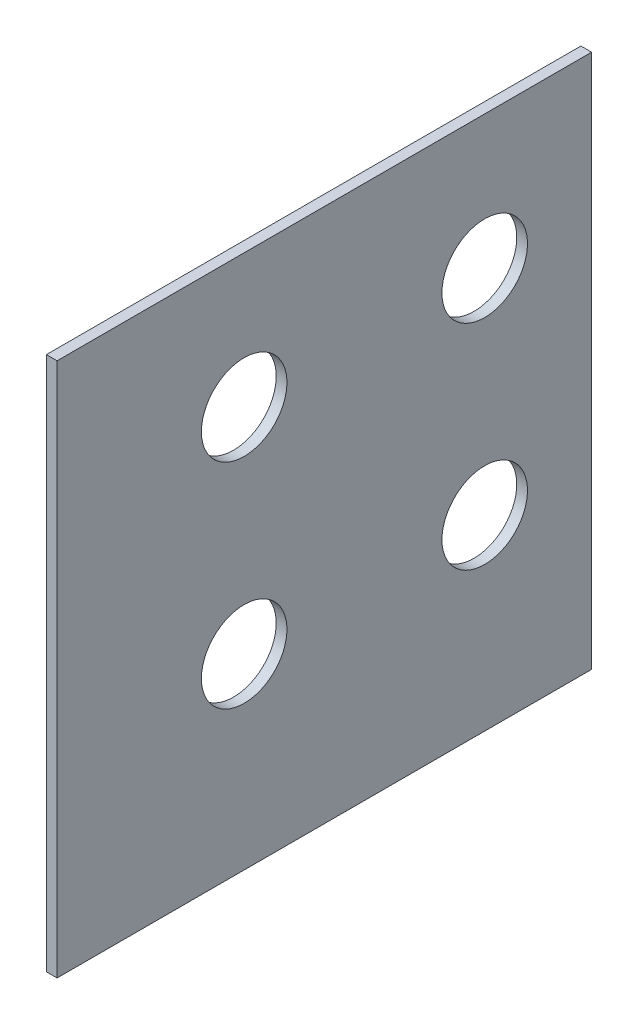
ISO-10303-21;
HEADER;
FILE_DESCRIPTION(('STEP AP214'),'2;1');
FILE_NAME('part.step','',(''),(''),'','','');
FILE_SCHEMA(('AUTOMOTIVE_DESIGN { 1 0 10303 214 1 1 1 1 }'));
ENDSEC;
DATA;
#1=APPLICATION_CONTEXT('core data for automotive mechanical design processes');
#2=APPLICATION_PROTOCOL_DEFINITION('international standard','automotive_design',2000,#1);
#3=PRODUCT_CONTEXT('',#1,'mechanical');
#4=PRODUCT('Part','Part','',(#3));
#5=PRODUCT_RELATED_PRODUCT_CATEGORY('part','',(#4));
#6=PRODUCT_DEFINITION_FORMATION('','',#4);
#7=PRODUCT_DEFINITION_CONTEXT('part definition',#1,'design');
#8=PRODUCT_DEFINITION('design','',#6,#7);
#9=PRODUCT_DEFINITION_SHAPE('','',#8);
#10=(LENGTH_UNIT() NAMED_UNIT(*) SI_UNIT(.MILLI.,.METRE.));
#11=(NAMED_UNIT(*) PLANE_ANGLE_UNIT() SI_UNIT($,.RADIAN.));
#12=(NAMED_UNIT(*) SI_UNIT($,.STERADIAN.) SOLID_ANGLE_UNIT());
#13=UNCERTAINTY_MEASURE_WITH_UNIT(LENGTH_MEASURE(1.E-05),#10,'distance_accuracy_value','');
#14=(GEOMETRIC_REPRESENTATION_CONTEXT(3) GLOBAL_UNCERTAINTY_ASSIGNED_CONTEXT((#13)) GLOBAL_UNIT_ASSIGNED_CONTEXT((#10,
#11,#12)) REPRESENTATION_CONTEXT('',''));
#15=CARTESIAN_POINT('',(0.,0.,0.));
#16=DIRECTION('',(0.,0.,1.));
#17=DIRECTION('',(1.,0.,0.));
#18=AXIS2_PLACEMENT_3D('',#15,#16,#17);
#19=CARTESIAN_POINT('',(0.4,-23.3926028357496,122.306860457024));
#20=DIRECTION('',(0.,0.,1.));
#21=DIRECTION('',(1.,0.,0.));
#22=AXIS2_PLACEMENT_3D('',#19,#20,#21);
#23=PLANE('',#22);
#24=DIRECTION('',(0.,1.,0.));
#25=VECTOR('',#24,1.);
#26=CARTESIAN_POINT('',(0.,-23.3926028357496,122.306860457024));
#27=LINE('',#26,#25);
#28=CARTESIAN_POINT('',(0.,-23.3926028357496,122.306860457024));
#29=VERTEX_POINT('',#28);
#30=CARTESIAN_POINT('',(0.,-3.39260283574958,122.306860457024));
#31=VERTEX_POINT('',#30);
#32=EDGE_CURVE('E98',#29,#31,#27,.T.);
#33=ORIENTED_EDGE('',*,*,#32,.T.);
#34=DIRECTION('',(-1.,0.,0.));
#35=VECTOR('',#34,1.);
#36=CARTESIAN_POINT('',(0.4,-3.39260283574958,122.306860457024));
#37=LINE('',#36,#35);
#38=CARTESIAN_POINT('',(0.4,-3.39260283574958,122.306860457024));
#39=VERTEX_POINT('',#38);
#40=EDGE_CURVE('E11',#39,#31,#37,.T.);
#41=ORIENTED_EDGE('',*,*,#40,.F.);
#42=DIRECTION('',(0.,1.,0.));
#43=VECTOR('',#42,1.);
#44=CARTESIAN_POINT('',(0.4,-23.3926028357496,122.306860457024));
#45=LINE('',#44,#43);
#46=CARTESIAN_POINT('',(0.4,-23.3926028357496,122.306860457024));
#47=VERTEX_POINT('',#46);
#48=EDGE_CURVE('E86',#47,#39,#45,.T.);
#49=ORIENTED_EDGE('',*,*,#48,.F.);
#50=DIRECTION('',(-1.,0.,0.));
#51=VECTOR('',#50,1.);
#52=CARTESIAN_POINT('',(0.4,-23.3926028357496,122.306860457024));
#53=LINE('',#52,#51);
#54=EDGE_CURVE('E94',#47,#29,#53,.T.);
#55=ORIENTED_EDGE('',*,*,#54,.T.);
#56=EDGE_LOOP('',(#33,#41,#49,#55));
#57=FACE_BOUND('',#56,.T.);
#58=ADVANCED_FACE('F35',(#57),#23,.F.);
#59=CARTESIAN_POINT('',(0.4,-3.39260283574958,122.306860457024));
#60=DIRECTION('',(0.,-1.,0.));
#61=DIRECTION('',(0.,0.,-1.));
#62=AXIS2_PLACEMENT_3D('',#59,#60,#61);
#63=PLANE('',#62);
#64=DIRECTION('',(0.,0.,1.));
#65=VECTOR('',#64,1.);
#66=CARTESIAN_POINT('',(0.,-3.39260283574958,122.306860457024));
#67=LINE('',#66,#65);
#68=CARTESIAN_POINT('',(0.,-3.39260283574959,142.306860457024));
#69=VERTEX_POINT('',#68);
#70=EDGE_CURVE('E90',#31,#69,#67,.T.);
#71=ORIENTED_EDGE('',*,*,#70,.T.);
#72=DIRECTION('',(-1.,0.,0.));
#73=VECTOR('',#72,1.);
#74=CARTESIAN_POINT('',(0.4,-3.39260283574959,142.306860457024));
#75=LINE('',#74,#73);
#76=CARTESIAN_POINT('',(0.4,-3.39260283574959,142.306860457024));
#77=VERTEX_POINT('',#76);
#78=EDGE_CURVE('E43',#77,#69,#75,.T.);
#79=ORIENTED_EDGE('',*,*,#78,.F.);
#80=DIRECTION('',(0.,0.,1.));
#81=VECTOR('',#80,1.);
#82=CARTESIAN_POINT('',(0.4,-3.39260283574958,122.306860457024));
#83=LINE('',#82,#81);
#84=EDGE_CURVE('E81',#39,#77,#83,.T.);
#85=ORIENTED_EDGE('',*,*,#84,.F.);
#86=ORIENTED_EDGE('',*,*,#40,.T.);
#87=EDGE_LOOP('',(#71,#79,#85,#86));
#88=FACE_BOUND('',#87,.T.);
#89=ADVANCED_FACE('F89',(#88),#63,.F.);
#90=CARTESIAN_POINT('',(0.4,-23.3926028357496,142.306860457024));
#91=DIRECTION('',(0.,0.,-1.));
#92=DIRECTION('',(-1.,0.,0.));
#93=AXIS2_PLACEMENT_3D('',#90,#91,#92);
#94=PLANE('',#93);
#95=DIRECTION('',(0.,-1.,0.));
#96=VECTOR('',#95,1.);
#97=CARTESIAN_POINT('',(0.,-23.3926028357496,142.306860457024));
#98=LINE('',#97,#96);
#99=CARTESIAN_POINT('',(0.,-23.3926028357496,142.306860457024));
#100=VERTEX_POINT('',#99);
#101=EDGE_CURVE('E68',#69,#100,#98,.T.);
#102=ORIENTED_EDGE('',*,*,#101,.T.);
#103=DIRECTION('',(-1.,0.,0.));
#104=VECTOR('',#103,1.);
#105=CARTESIAN_POINT('',(0.4,-23.3926028357496,142.306860457024));
#106=LINE('',#105,#104);
#107=CARTESIAN_POINT('',(0.4,-23.3926028357496,142.306860457024));
#108=VERTEX_POINT('',#107);
#109=EDGE_CURVE('E91',#108,#100,#106,.T.);
#110=ORIENTED_EDGE('',*,*,#109,.F.);
#111=DIRECTION('',(0.,-1.,0.));
#112=VECTOR('',#111,1.);
#113=CARTESIAN_POINT('',(0.4,-23.3926028357496,142.306860457024));
#114=LINE('',#113,#112);
#115=EDGE_CURVE('E84',#77,#108,#114,.T.);
#116=ORIENTED_EDGE('',*,*,#115,.F.);
#117=ORIENTED_EDGE('',*,*,#78,.T.);
#118=EDGE_LOOP('',(#102,#110,#116,#117));
#119=FACE_BOUND('',#118,.T.);
#120=ADVANCED_FACE('F92',(#119),#94,.F.);
#121=CARTESIAN_POINT('',(0.4,-23.3926028357496,122.306860457024));
#122=DIRECTION('',(0.,1.,0.));
#123=DIRECTION('',(0.,0.,1.));
#124=AXIS2_PLACEMENT_3D('',#121,#122,#123);
#125=PLANE('',#124);
#126=DIRECTION('',(0.,0.,-1.));
#127=VECTOR('',#126,1.);
#128=CARTESIAN_POINT('',(0.,-23.3926028357496,122.306860457024));
#129=LINE('',#128,#127);
#130=EDGE_CURVE('E74',#100,#29,#129,.T.);
#131=ORIENTED_EDGE('',*,*,#130,.T.);
#132=ORIENTED_EDGE('',*,*,#54,.F.);
#133=DIRECTION('',(0.,0.,-1.));
#134=VECTOR('',#133,1.);
#135=CARTESIAN_POINT('',(0.4,-23.3926028357496,122.306860457024));
#136=LINE('',#135,#134);
#137=EDGE_CURVE('E51',#108,#47,#136,.T.);
#138=ORIENTED_EDGE('',*,*,#137,.F.);
#139=ORIENTED_EDGE('',*,*,#109,.T.);
#140=EDGE_LOOP('',(#131,#132,#138,#139));
#141=FACE_BOUND('',#140,.T.);
#142=ADVANCED_FACE('F106',(#141),#125,.F.);
#143=CARTESIAN_POINT('',(0.4,0.,0.));
#144=DIRECTION('',(1.,0.,0.));
#145=DIRECTION('',(0.,0.,-1.));
#146=AXIS2_PLACEMENT_3D('',#143,#144,#145);
#147=PLANE('',#146);
#148=CARTESIAN_POINT('',(0.4,-16.3926028357496,126.306860457024));
#149=DIRECTION('',(-1.,0.,0.));
#150=DIRECTION('',(0.,0.,1.));
#151=AXIS2_PLACEMENT_3D('',#148,#149,#150);
#152=CIRCLE('',#151,1.59999999999999);
#153=CARTESIAN_POINT('',(0.4,-16.3926028357496,127.906860457024));
#154=VERTEX_POINT('',#153);
#155=EDGE_CURVE('E115',#154,#154,#152,.T.);
#156=ORIENTED_EDGE('',*,*,#155,.T.);
#157=EDGE_LOOP('',(#156));
#158=FACE_BOUND('',#157,.T.);
#159=CARTESIAN_POINT('',(0.4,-8.39260283574958,135.306860457024));
#160=DIRECTION('',(-1.,0.,0.));
#161=DIRECTION('',(0.,0.,1.));
#162=AXIS2_PLACEMENT_3D('',#159,#160,#161);
#163=CIRCLE('',#162,1.59999999999999);
#164=CARTESIAN_POINT('',(0.4,-8.39260283574958,136.906860457024));
#165=VERTEX_POINT('',#164);
#166=EDGE_CURVE('E121',#165,#165,#163,.T.);
#167=ORIENTED_EDGE('',*,*,#166,.T.);
#168=EDGE_LOOP('',(#167));
#169=FACE_BOUND('',#168,.T.);
#170=CARTESIAN_POINT('',(0.4,-16.3926028357496,135.306860457024));
#171=DIRECTION('',(-1.,0.,0.));
#172=DIRECTION('',(0.,0.,1.));
#173=AXIS2_PLACEMENT_3D('',#170,#171,#172);
#174=CIRCLE('',#173,1.59999999999999);
#175=CARTESIAN_POINT('',(0.4,-16.3926028357496,136.906860457024));
#176=VERTEX_POINT('',#175);
#177=EDGE_CURVE('E122',#176,#176,#174,.T.);
#178=ORIENTED_EDGE('',*,*,#177,.T.);
#179=EDGE_LOOP('',(#178));
#180=FACE_BOUND('',#179,.T.);
#181=CARTESIAN_POINT('',(0.4,-8.39260283574958,126.306860457024));
#182=DIRECTION('',(-1.,0.,0.));
#183=DIRECTION('',(0.,0.,1.));
#184=AXIS2_PLACEMENT_3D('',#181,#182,#183);
#185=CIRCLE('',#184,1.59999999999999);
#186=CARTESIAN_POINT('',(0.4,-8.39260283574958,127.906860457024));
#187=VERTEX_POINT('',#186);
#188=EDGE_CURVE('E101',#187,#187,#185,.T.);
#189=ORIENTED_EDGE('',*,*,#188,.T.);
#190=EDGE_LOOP('',(#189));
#191=FACE_BOUND('',#190,.T.);
#192=ORIENTED_EDGE('',*,*,#48,.T.);
#193=ORIENTED_EDGE('',*,*,#84,.T.);
#194=ORIENTED_EDGE('',*,*,#115,.T.);
#195=ORIENTED_EDGE('',*,*,#137,.T.);
#196=EDGE_LOOP('',(#192,#193,#194,#195));
#197=FACE_BOUND('',#196,.T.);
#198=ADVANCED_FACE('F82',(#158,#169,#180,#191,#197),#147,.T.);
#199=CARTESIAN_POINT('',(0.,0.,0.));
#200=DIRECTION('',(1.,0.,0.));
#201=DIRECTION('',(0.,0.,-1.));
#202=AXIS2_PLACEMENT_3D('',#199,#200,#201);
#203=PLANE('',#202);
#204=CARTESIAN_POINT('',(0.,-16.3926028357496,126.306860457024));
#205=DIRECTION('',(-1.,0.,0.));
#206=DIRECTION('',(0.,0.,1.));
#207=AXIS2_PLACEMENT_3D('',#204,#205,#206);
#208=CIRCLE('',#207,1.59999999999999);
#209=CARTESIAN_POINT('',(0.,-16.3926028357496,127.906860457024));
#210=VERTEX_POINT('',#209);
#211=EDGE_CURVE('E125',#210,#210,#208,.T.);
#212=ORIENTED_EDGE('',*,*,#211,.F.);
#213=EDGE_LOOP('',(#212));
#214=FACE_BOUND('',#213,.T.);
#215=CARTESIAN_POINT('',(0.,-8.39260283574958,135.306860457024));
#216=DIRECTION('',(-1.,0.,0.));
#217=DIRECTION('',(0.,0.,1.));
#218=AXIS2_PLACEMENT_3D('',#215,#216,#217);
#219=CIRCLE('',#218,1.59999999999999);
#220=CARTESIAN_POINT('',(0.,-8.39260283574958,136.906860457024));
#221=VERTEX_POINT('',#220);
#222=EDGE_CURVE('E118',#221,#221,#219,.T.);
#223=ORIENTED_EDGE('',*,*,#222,.F.);
#224=EDGE_LOOP('',(#223));
#225=FACE_BOUND('',#224,.T.);
#226=CARTESIAN_POINT('',(0.,-16.3926028357496,135.306860457024));
#227=DIRECTION('',(-1.,0.,0.));
#228=DIRECTION('',(0.,0.,1.));
#229=AXIS2_PLACEMENT_3D('',#226,#227,#228);
#230=CIRCLE('',#229,1.59999999999999);
#231=CARTESIAN_POINT('',(0.,-16.3926028357496,136.906860457024));
#232=VERTEX_POINT('',#231);
#233=EDGE_CURVE('E130',#232,#232,#230,.T.);
#234=ORIENTED_EDGE('',*,*,#233,.F.);
#235=EDGE_LOOP('',(#234));
#236=FACE_BOUND('',#235,.T.);
#237=CARTESIAN_POINT('',(0.,-8.39260283574958,126.306860457024));
#238=DIRECTION('',(-1.,0.,0.));
#239=DIRECTION('',(0.,0.,1.));
#240=AXIS2_PLACEMENT_3D('',#237,#238,#239);
#241=CIRCLE('',#240,1.59999999999999);
#242=CARTESIAN_POINT('',(0.,-8.39260283574958,127.906860457024));
#243=VERTEX_POINT('',#242);
#244=EDGE_CURVE('E112',#243,#243,#241,.T.);
#245=ORIENTED_EDGE('',*,*,#244,.F.);
#246=EDGE_LOOP('',(#245));
#247=FACE_BOUND('',#246,.T.);
#248=ORIENTED_EDGE('',*,*,#32,.F.);
#249=ORIENTED_EDGE('',*,*,#130,.F.);
#250=ORIENTED_EDGE('',*,*,#101,.F.);
#251=ORIENTED_EDGE('',*,*,#70,.F.);
#252=EDGE_LOOP('',(#248,#249,#250,#251));
#253=FACE_BOUND('',#252,.T.);
#254=ADVANCED_FACE('F109',(#214,#225,#236,#247,#253),#203,.F.);
#255=CARTESIAN_POINT('',(0.4,-8.39260283574958,126.306860457024));
#256=DIRECTION('',(-1.,0.,0.));
#257=DIRECTION('',(0.,0.,1.));
#258=AXIS2_PLACEMENT_3D('',#255,#256,#257);
#259=CYLINDRICAL_SURFACE('',#258,1.59999999999999);
#260=ORIENTED_EDGE('',*,*,#188,.F.);
#261=EDGE_LOOP('',(#260));
#262=FACE_BOUND('',#261,.T.);
#263=ORIENTED_EDGE('',*,*,#244,.T.);
#264=EDGE_LOOP('',(#263));
#265=FACE_BOUND('',#264,.T.);
#266=ADVANCED_FACE('F142',(#262,#265),#259,.F.);
#267=CARTESIAN_POINT('',(0.4,-16.3926028357496,135.306860457024));
#268=DIRECTION('',(-1.,0.,0.));
#269=DIRECTION('',(0.,0.,1.));
#270=AXIS2_PLACEMENT_3D('',#267,#268,#269);
#271=CYLINDRICAL_SURFACE('',#270,1.59999999999999);
#272=ORIENTED_EDGE('',*,*,#177,.F.);
#273=EDGE_LOOP('',(#272));
#274=FACE_BOUND('',#273,.T.);
#275=ORIENTED_EDGE('',*,*,#233,.T.);
#276=EDGE_LOOP('',(#275));
#277=FACE_BOUND('',#276,.T.);
#278=ADVANCED_FACE('F138',(#274,#277),#271,.F.);
#279=CARTESIAN_POINT('',(0.4,-8.39260283574958,135.306860457024));
#280=DIRECTION('',(-1.,0.,0.));
#281=DIRECTION('',(0.,0.,1.));
#282=AXIS2_PLACEMENT_3D('',#279,#280,#281);
#283=CYLINDRICAL_SURFACE('',#282,1.59999999999999);
#284=ORIENTED_EDGE('',*,*,#166,.F.);
#285=EDGE_LOOP('',(#284));
#286=FACE_BOUND('',#285,.T.);
#287=ORIENTED_EDGE('',*,*,#222,.T.);
#288=EDGE_LOOP('',(#287));
#289=FACE_BOUND('',#288,.T.);
#290=ADVANCED_FACE('F141',(#286,#289),#283,.F.);
#291=CARTESIAN_POINT('',(0.4,-16.3926028357496,126.306860457024));
#292=DIRECTION('',(-1.,0.,0.));
#293=DIRECTION('',(0.,0.,1.));
#294=AXIS2_PLACEMENT_3D('',#291,#292,#293);
#295=CYLINDRICAL_SURFACE('',#294,1.59999999999999);
#296=ORIENTED_EDGE('',*,*,#155,.F.);
#297=EDGE_LOOP('',(#296));
#298=FACE_BOUND('',#297,.T.);
#299=ORIENTED_EDGE('',*,*,#211,.T.);
#300=EDGE_LOOP('',(#299));
#301=FACE_BOUND('',#300,.T.);
#302=ADVANCED_FACE('F180',(#298,#301),#295,.F.);
#303=CLOSED_SHELL('',(#58,#89,#120,#142,#198,#254,#266,#278,#290,#302));
#304=MANIFOLD_SOLID_BREP('B2',#303);
#305=ADVANCED_BREP_SHAPE_REPRESENTATION('',(#18,#304),#14);
#306=SHAPE_DEFINITION_REPRESENTATION(#9,#305);
ENDSEC;
END-ISO-10303-21;
